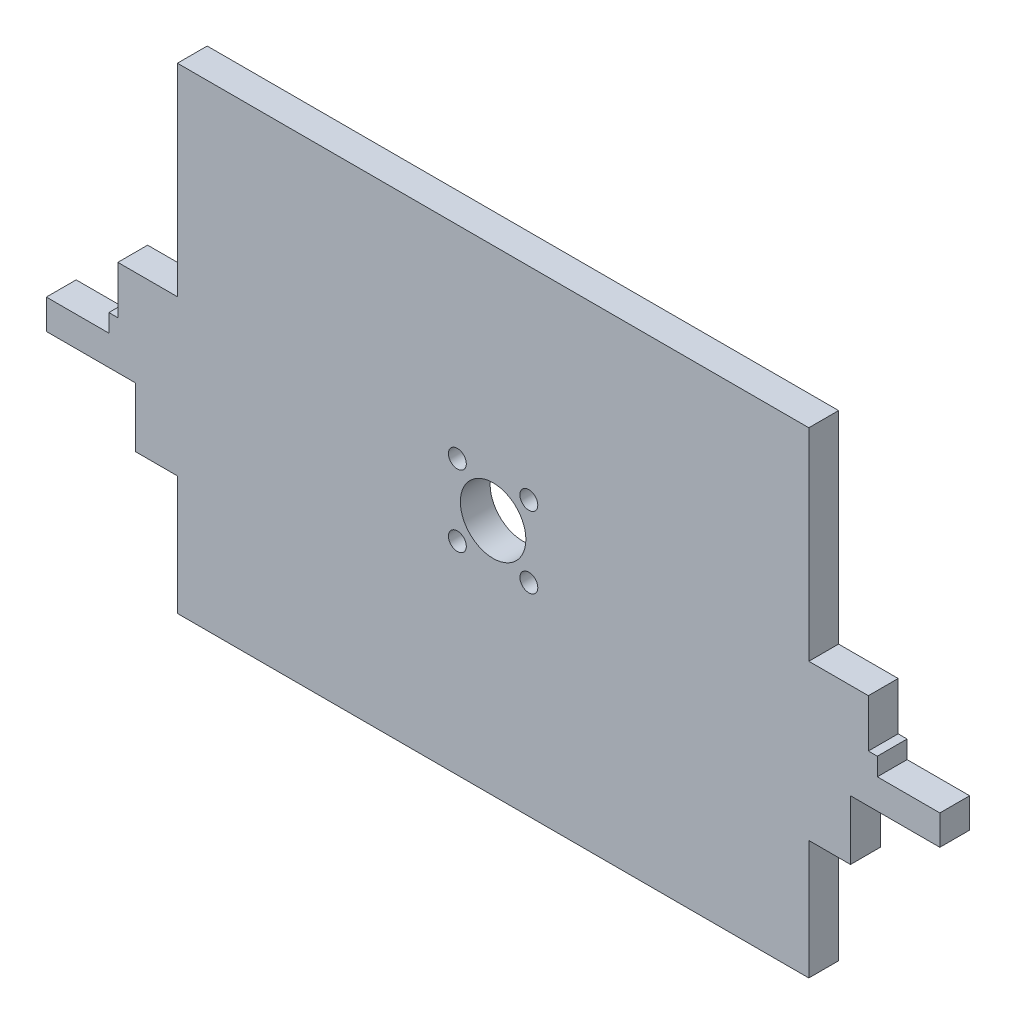
ISO-10303-21;
HEADER;
FILE_DESCRIPTION(('STEP AP214'),'2;1');
FILE_NAME('part.step','',(''),(''),'','','');
FILE_SCHEMA(('AUTOMOTIVE_DESIGN { 1 0 10303 214 1 1 1 1 }'));
ENDSEC;
DATA;
#1=APPLICATION_CONTEXT('core data for automotive mechanical design processes');
#2=APPLICATION_PROTOCOL_DEFINITION('international standard','automotive_design',2000,#1);
#3=PRODUCT_CONTEXT('',#1,'mechanical');
#4=PRODUCT('Part','Part','',(#3));
#5=PRODUCT_RELATED_PRODUCT_CATEGORY('part','',(#4));
#6=PRODUCT_DEFINITION_FORMATION('','',#4);
#7=PRODUCT_DEFINITION_CONTEXT('part definition',#1,'design');
#8=PRODUCT_DEFINITION('design','',#6,#7);
#9=PRODUCT_DEFINITION_SHAPE('','',#8);
#10=(LENGTH_UNIT() NAMED_UNIT(*) SI_UNIT(.MILLI.,.METRE.));
#11=(NAMED_UNIT(*) PLANE_ANGLE_UNIT() SI_UNIT($,.RADIAN.));
#12=(NAMED_UNIT(*) SI_UNIT($,.STERADIAN.) SOLID_ANGLE_UNIT());
#13=UNCERTAINTY_MEASURE_WITH_UNIT(LENGTH_MEASURE(1.E-05),#10,'distance_accuracy_value','');
#14=(GEOMETRIC_REPRESENTATION_CONTEXT(3) GLOBAL_UNCERTAINTY_ASSIGNED_CONTEXT((#13)) GLOBAL_UNIT_ASSIGNED_CONTEXT((#10,
#11,#12)) REPRESENTATION_CONTEXT('',''));
#15=CARTESIAN_POINT('',(0.,0.,0.));
#16=DIRECTION('',(0.,0.,1.));
#17=DIRECTION('',(1.,0.,0.));
#18=AXIS2_PLACEMENT_3D('',#15,#16,#17);
#19=CARTESIAN_POINT('',(-63.,0.,5.));
#20=DIRECTION('',(-1.,0.,0.));
#21=DIRECTION('',(0.,0.,1.));
#22=AXIS2_PLACEMENT_3D('',#19,#20,#21);
#23=PLANE('',#22);
#24=DIRECTION('',(0.,1.,0.));
#25=VECTOR('',#24,1.);
#26=CARTESIAN_POINT('',(-63.,0.,0.));
#27=LINE('',#26,#25);
#28=CARTESIAN_POINT('',(-63.,3.00000000000002,0.));
#29=VERTEX_POINT('',#28);
#30=CARTESIAN_POINT('',(-63.,11.0474120979369,0.));
#31=VERTEX_POINT('',#30);
#32=EDGE_CURVE('E244',#29,#31,#27,.T.);
#33=ORIENTED_EDGE('',*,*,#32,.F.);
#34=DIRECTION('',(0.,0.,-1.));
#35=VECTOR('',#34,1.);
#36=CARTESIAN_POINT('',(-63.,3.00000000000002,5.));
#37=LINE('',#36,#35);
#38=CARTESIAN_POINT('',(-63.,3.00000000000002,5.));
#39=VERTEX_POINT('',#38);
#40=EDGE_CURVE('E228',#39,#29,#37,.T.);
#41=ORIENTED_EDGE('',*,*,#40,.F.);
#42=DIRECTION('',(0.,1.,0.));
#43=VECTOR('',#42,1.);
#44=CARTESIAN_POINT('',(-63.,0.,5.));
#45=LINE('',#44,#43);
#46=CARTESIAN_POINT('',(-63.,11.0474120979369,5.));
#47=VERTEX_POINT('',#46);
#48=EDGE_CURVE('E254',#39,#47,#45,.T.);
#49=ORIENTED_EDGE('',*,*,#48,.T.);
#50=DIRECTION('',(0.,0.,-1.));
#51=VECTOR('',#50,1.);
#52=CARTESIAN_POINT('',(-63.,11.0474120979369,10.));
#53=LINE('',#52,#51);
#54=EDGE_CURVE('E252',#47,#31,#53,.T.);
#55=ORIENTED_EDGE('',*,*,#54,.T.);
#56=EDGE_LOOP('',(#33,#41,#49,#55));
#57=FACE_BOUND('',#56,.T.);
#58=ADVANCED_FACE('F67',(#57),#23,.T.);
#59=CARTESIAN_POINT('',(75.,0.,0.));
#60=DIRECTION('',(0.,-1.,0.));
#61=DIRECTION('',(0.,0.,-1.));
#62=AXIS2_PLACEMENT_3D('',#59,#60,#61);
#63=PLANE('',#62);
#64=DIRECTION('',(0.,0.,-1.));
#65=VECTOR('',#64,1.);
#66=CARTESIAN_POINT('',(64.5,0.,5.));
#67=LINE('',#66,#65);
#68=CARTESIAN_POINT('',(64.5,0.,5.));
#69=VERTEX_POINT('',#68);
#70=CARTESIAN_POINT('',(64.5,0.,0.));
#71=VERTEX_POINT('',#70);
#72=EDGE_CURVE('E417',#69,#71,#67,.T.);
#73=ORIENTED_EDGE('',*,*,#72,.F.);
#74=DIRECTION('',(-1.,0.,0.));
#75=VECTOR('',#74,1.);
#76=CARTESIAN_POINT('',(75.,0.,5.));
#77=LINE('',#76,#75);
#78=CARTESIAN_POINT('',(75.,0.,5.));
#79=VERTEX_POINT('',#78);
#80=EDGE_CURVE('E307',#79,#69,#77,.T.);
#81=ORIENTED_EDGE('',*,*,#80,.F.);
#82=DIRECTION('',(0.,0.,1.));
#83=VECTOR('',#82,1.);
#84=CARTESIAN_POINT('',(75.,0.,0.));
#85=LINE('',#84,#83);
#86=CARTESIAN_POINT('',(75.,0.,0.));
#87=VERTEX_POINT('',#86);
#88=EDGE_CURVE('E293',#87,#79,#85,.T.);
#89=ORIENTED_EDGE('',*,*,#88,.F.);
#90=DIRECTION('',(-1.,0.,0.));
#91=VECTOR('',#90,1.);
#92=CARTESIAN_POINT('',(75.,0.,0.));
#93=LINE('',#92,#91);
#94=EDGE_CURVE('E310',#87,#71,#93,.T.);
#95=ORIENTED_EDGE('',*,*,#94,.T.);
#96=EDGE_LOOP('',(#73,#81,#89,#95));
#97=FACE_BOUND('',#96,.T.);
#98=ADVANCED_FACE('F497',(#97),#63,.F.);
#99=CARTESIAN_POINT('',(0.,0.,5.));
#100=DIRECTION('',(0.,0.,1.));
#101=DIRECTION('',(1.,0.,0.));
#102=AXIS2_PLACEMENT_3D('',#99,#100,#101);
#103=PLANE('',#102);
#104=CARTESIAN_POINT('',(6.00000000000184,11.,5.));
#105=DIRECTION('',(0.,0.,1.));
#106=DIRECTION('',(1.,0.,0.));
#107=AXIS2_PLACEMENT_3D('',#104,#105,#106);
#108=CIRCLE('',#107,1.5);
#109=CARTESIAN_POINT('',(7.50000000000184,11.,5.));
#110=VERTEX_POINT('',#109);
#111=EDGE_CURVE('E239',#110,#110,#108,.T.);
#112=ORIENTED_EDGE('',*,*,#111,.F.);
#113=EDGE_LOOP('',(#112));
#114=FACE_BOUND('',#113,.T.);
#115=CARTESIAN_POINT('',(6.00000000000184,-1.00000000000004,5.));
#116=DIRECTION('',(0.,0.,1.));
#117=DIRECTION('',(1.,0.,0.));
#118=AXIS2_PLACEMENT_3D('',#115,#116,#117);
#119=CIRCLE('',#118,1.5);
#120=CARTESIAN_POINT('',(7.50000000000184,-1.00000000000004,5.));
#121=VERTEX_POINT('',#120);
#122=EDGE_CURVE('E444',#121,#121,#119,.T.);
#123=ORIENTED_EDGE('',*,*,#122,.F.);
#124=EDGE_LOOP('',(#123));
#125=FACE_BOUND('',#124,.T.);
#126=CARTESIAN_POINT('',(-5.99999999999816,-1.00000000000003,5.));
#127=DIRECTION('',(0.,0.,1.));
#128=DIRECTION('',(1.,0.,0.));
#129=AXIS2_PLACEMENT_3D('',#126,#127,#128);
#130=CIRCLE('',#129,1.5);
#131=CARTESIAN_POINT('',(-4.49999999999816,-1.00000000000003,5.));
#132=VERTEX_POINT('',#131);
#133=EDGE_CURVE('E447',#132,#132,#130,.T.);
#134=ORIENTED_EDGE('',*,*,#133,.F.);
#135=EDGE_LOOP('',(#134));
#136=FACE_BOUND('',#135,.T.);
#137=CARTESIAN_POINT('',(-5.99999999999816,11.,5.));
#138=DIRECTION('',(0.,0.,1.));
#139=DIRECTION('',(1.,0.,0.));
#140=AXIS2_PLACEMENT_3D('',#137,#138,#139);
#141=CIRCLE('',#140,1.5);
#142=CARTESIAN_POINT('',(-4.49999999999816,11.,5.));
#143=VERTEX_POINT('',#142);
#144=EDGE_CURVE('E450',#143,#143,#141,.T.);
#145=ORIENTED_EDGE('',*,*,#144,.F.);
#146=EDGE_LOOP('',(#145));
#147=FACE_BOUND('',#146,.T.);
#148=CARTESIAN_POINT('',(1.84227633148737E-12,4.99999999999996,5.));
#149=DIRECTION('',(0.,0.,1.));
#150=DIRECTION('',(1.,0.,0.));
#151=AXIS2_PLACEMENT_3D('',#148,#149,#150);
#152=CIRCLE('',#151,5.5);
#153=CARTESIAN_POINT('',(5.50000000000184,4.99999999999996,5.));
#154=VERTEX_POINT('',#153);
#155=EDGE_CURVE('E453',#154,#154,#152,.T.);
#156=ORIENTED_EDGE('',*,*,#155,.F.);
#157=EDGE_LOOP('',(#156));
#158=FACE_BOUND('',#157,.T.);
#159=ORIENTED_EDGE('',*,*,#48,.F.);
#160=DIRECTION('',(-1.,0.,0.));
#161=VECTOR('',#160,1.);
#162=CARTESIAN_POINT('',(-63.,3.00000000000002,5.));
#163=LINE('',#162,#161);
#164=CARTESIAN_POINT('',(-64.5,3.00000000000002,5.));
#165=VERTEX_POINT('',#164);
#166=EDGE_CURVE('E234',#39,#165,#163,.T.);
#167=ORIENTED_EDGE('',*,*,#166,.T.);
#168=DIRECTION('',(0.,1.,0.));
#169=VECTOR('',#168,1.);
#170=CARTESIAN_POINT('',(-64.5,0.,5.));
#171=LINE('',#170,#169);
#172=CARTESIAN_POINT('',(-64.5,0.,5.));
#173=VERTEX_POINT('',#172);
#174=EDGE_CURVE('E248',#173,#165,#171,.T.);
#175=ORIENTED_EDGE('',*,*,#174,.F.);
#176=DIRECTION('',(1.,0.,0.));
#177=VECTOR('',#176,1.);
#178=CARTESIAN_POINT('',(-75.,0.,5.));
#179=LINE('',#178,#177);
#180=CARTESIAN_POINT('',(-75.,0.,5.));
#181=VERTEX_POINT('',#180);
#182=EDGE_CURVE('E280',#181,#173,#179,.T.);
#183=ORIENTED_EDGE('',*,*,#182,.F.);
#184=DIRECTION('',(0.,1.,0.));
#185=VECTOR('',#184,1.);
#186=CARTESIAN_POINT('',(-75.,0.,5.));
#187=LINE('',#186,#185);
#188=CARTESIAN_POINT('',(-75.,-5.00258790206309,5.));
#189=VERTEX_POINT('',#188);
#190=EDGE_CURVE('E272',#189,#181,#187,.T.);
#191=ORIENTED_EDGE('',*,*,#190,.F.);
#192=DIRECTION('',(1.,0.,0.));
#193=VECTOR('',#192,1.);
#194=CARTESIAN_POINT('',(-75.,-5.00258790206309,5.));
#195=LINE('',#194,#193);
#196=CARTESIAN_POINT('',(-60.,-5.00258790206309,5.));
#197=VERTEX_POINT('',#196);
#198=EDGE_CURVE('E283',#189,#197,#195,.T.);
#199=ORIENTED_EDGE('',*,*,#198,.T.);
#200=DIRECTION('',(0.,-1.,0.));
#201=VECTOR('',#200,1.);
#202=CARTESIAN_POINT('',(-60.,-45.,5.));
#203=LINE('',#202,#201);
#204=CARTESIAN_POINT('',(-60.,-15.,5.));
#205=VERTEX_POINT('',#204);
#206=EDGE_CURVE('E320',#197,#205,#203,.T.);
#207=ORIENTED_EDGE('',*,*,#206,.T.);
#208=DIRECTION('',(-1.,0.,0.));
#209=VECTOR('',#208,1.);
#210=CARTESIAN_POINT('',(0.,-15.,5.));
#211=LINE('',#210,#209);
#212=CARTESIAN_POINT('',(-53.,-15.,5.));
#213=VERTEX_POINT('',#212);
#214=EDGE_CURVE('E346',#213,#205,#211,.T.);
#215=ORIENTED_EDGE('',*,*,#214,.F.);
#216=DIRECTION('',(0.,-1.,0.));
#217=VECTOR('',#216,1.);
#218=CARTESIAN_POINT('',(-53.,0.,5.));
#219=LINE('',#218,#217);
#220=CARTESIAN_POINT('',(-53.,-35.,5.));
#221=VERTEX_POINT('',#220);
#222=EDGE_CURVE('E345',#213,#221,#219,.T.);
#223=ORIENTED_EDGE('',*,*,#222,.T.);
#224=DIRECTION('',(-1.,0.,0.));
#225=VECTOR('',#224,1.);
#226=CARTESIAN_POINT('',(0.,-35.,5.));
#227=LINE('',#226,#225);
#228=CARTESIAN_POINT('',(53.,-35.,5.));
#229=VERTEX_POINT('',#228);
#230=EDGE_CURVE('E316',#229,#221,#227,.T.);
#231=ORIENTED_EDGE('',*,*,#230,.F.);
#232=DIRECTION('',(0.,-1.,0.));
#233=VECTOR('',#232,1.);
#234=CARTESIAN_POINT('',(53.,0.,5.));
#235=LINE('',#234,#233);
#236=CARTESIAN_POINT('',(53.,-15.,5.));
#237=VERTEX_POINT('',#236);
#238=EDGE_CURVE('E89',#237,#229,#235,.T.);
#239=ORIENTED_EDGE('',*,*,#238,.F.);
#240=DIRECTION('',(1.,0.,0.));
#241=VECTOR('',#240,1.);
#242=CARTESIAN_POINT('',(0.,-15.,5.));
#243=LINE('',#242,#241);
#244=CARTESIAN_POINT('',(60.,-15.,5.));
#245=VERTEX_POINT('',#244);
#246=EDGE_CURVE('E348',#237,#245,#243,.T.);
#247=ORIENTED_EDGE('',*,*,#246,.T.);
#248=DIRECTION('',(0.,1.,0.));
#249=VECTOR('',#248,1.);
#250=CARTESIAN_POINT('',(60.,-45.,5.));
#251=LINE('',#250,#249);
#252=CARTESIAN_POINT('',(60.,-5.00258790206311,5.));
#253=VERTEX_POINT('',#252);
#254=EDGE_CURVE('E323',#245,#253,#251,.T.);
#255=ORIENTED_EDGE('',*,*,#254,.T.);
#256=DIRECTION('',(-1.,0.,0.));
#257=VECTOR('',#256,1.);
#258=CARTESIAN_POINT('',(75.,-5.00258790206309,5.));
#259=LINE('',#258,#257);
#260=CARTESIAN_POINT('',(75.,-5.00258790206309,5.));
#261=VERTEX_POINT('',#260);
#262=EDGE_CURVE('E304',#261,#253,#259,.T.);
#263=ORIENTED_EDGE('',*,*,#262,.F.);
#264=DIRECTION('',(0.,-1.,0.));
#265=VECTOR('',#264,1.);
#266=CARTESIAN_POINT('',(75.,0.,5.));
#267=LINE('',#266,#265);
#268=EDGE_CURVE('E295',#79,#261,#267,.T.);
#269=ORIENTED_EDGE('',*,*,#268,.F.);
#270=ORIENTED_EDGE('',*,*,#80,.T.);
#271=DIRECTION('',(0.,1.,0.));
#272=VECTOR('',#271,1.);
#273=CARTESIAN_POINT('',(64.5,0.,5.));
#274=LINE('',#273,#272);
#275=CARTESIAN_POINT('',(64.5,3.,5.));
#276=VERTEX_POINT('',#275);
#277=EDGE_CURVE('E427',#69,#276,#274,.T.);
#278=ORIENTED_EDGE('',*,*,#277,.T.);
#279=DIRECTION('',(1.,0.,0.));
#280=VECTOR('',#279,1.);
#281=CARTESIAN_POINT('',(0.,3.,5.));
#282=LINE('',#281,#280);
#283=CARTESIAN_POINT('',(63.,3.,5.));
#284=VERTEX_POINT('',#283);
#285=EDGE_CURVE('E420',#284,#276,#282,.T.);
#286=ORIENTED_EDGE('',*,*,#285,.F.);
#287=DIRECTION('',(0.,-1.,0.));
#288=VECTOR('',#287,1.);
#289=CARTESIAN_POINT('',(63.,0.,5.));
#290=LINE('',#289,#288);
#291=CARTESIAN_POINT('',(63.,11.0474120979369,5.));
#292=VERTEX_POINT('',#291);
#293=EDGE_CURVE('E257',#292,#284,#290,.T.);
#294=ORIENTED_EDGE('',*,*,#293,.F.);
#295=DIRECTION('',(1.,0.,0.));
#296=VECTOR('',#295,1.);
#297=CARTESIAN_POINT('',(0.,11.0474120979369,5.));
#298=LINE('',#297,#296);
#299=CARTESIAN_POINT('',(53.,11.0474120979369,5.));
#300=VERTEX_POINT('',#299);
#301=EDGE_CURVE('E351',#300,#292,#298,.T.);
#302=ORIENTED_EDGE('',*,*,#301,.F.);
#303=DIRECTION('',(0.,-1.,0.));
#304=VECTOR('',#303,1.);
#305=CARTESIAN_POINT('',(53.,0.,5.));
#306=LINE('',#305,#304);
#307=CARTESIAN_POINT('',(53.,45.,5.));
#308=VERTEX_POINT('',#307);
#309=EDGE_CURVE('E259',#308,#300,#306,.T.);
#310=ORIENTED_EDGE('',*,*,#309,.F.);
#311=DIRECTION('',(-1.,0.,0.));
#312=VECTOR('',#311,1.);
#313=CARTESIAN_POINT('',(60.,45.,5.));
#314=LINE('',#313,#312);
#315=CARTESIAN_POINT('',(-53.,45.,5.));
#316=VERTEX_POINT('',#315);
#317=EDGE_CURVE('E326',#308,#316,#314,.T.);
#318=ORIENTED_EDGE('',*,*,#317,.T.);
#319=DIRECTION('',(0.,1.,0.));
#320=VECTOR('',#319,1.);
#321=CARTESIAN_POINT('',(-53.,0.,5.));
#322=LINE('',#321,#320);
#323=CARTESIAN_POINT('',(-53.,11.0474120979369,5.));
#324=VERTEX_POINT('',#323);
#325=EDGE_CURVE('E366',#324,#316,#322,.T.);
#326=ORIENTED_EDGE('',*,*,#325,.F.);
#327=DIRECTION('',(-1.,0.,0.));
#328=VECTOR('',#327,1.);
#329=CARTESIAN_POINT('',(0.,11.0474120979369,5.));
#330=LINE('',#329,#328);
#331=EDGE_CURVE('E356',#324,#47,#330,.T.);
#332=ORIENTED_EDGE('',*,*,#331,.T.);
#333=EDGE_LOOP('',(#159,#167,#175,#183,#191,#199,#207,#215,#223,#231,#239,#247,#255,#263,#269,
#270,#278,#286,#294,#302,#310,#318,#326,#332));
#334=FACE_BOUND('',#333,.T.);
#335=ADVANCED_FACE('F342',(#114,#125,#136,#147,#158,#334),#103,.T.);
#336=CARTESIAN_POINT('',(0.,0.,0.));
#337=DIRECTION('',(0.,0.,1.));
#338=DIRECTION('',(1.,0.,0.));
#339=AXIS2_PLACEMENT_3D('',#336,#337,#338);
#340=PLANE('',#339);
#341=CARTESIAN_POINT('',(6.00000000000184,11.,0.));
#342=DIRECTION('',(0.,0.,-1.));
#343=DIRECTION('',(-1.,0.,0.));
#344=AXIS2_PLACEMENT_3D('',#341,#342,#343);
#345=CIRCLE('',#344,1.5);
#346=CARTESIAN_POINT('',(4.50000000000184,11.,0.));
#347=VERTEX_POINT('',#346);
#348=EDGE_CURVE('E460',#347,#347,#345,.T.);
#349=ORIENTED_EDGE('',*,*,#348,.F.);
#350=EDGE_LOOP('',(#349));
#351=FACE_BOUND('',#350,.T.);
#352=CARTESIAN_POINT('',(6.00000000000184,-1.00000000000004,0.));
#353=DIRECTION('',(0.,0.,-1.));
#354=DIRECTION('',(-1.,0.,0.));
#355=AXIS2_PLACEMENT_3D('',#352,#353,#354);
#356=CIRCLE('',#355,1.5);
#357=CARTESIAN_POINT('',(4.50000000000184,-1.00000000000004,0.));
#358=VERTEX_POINT('',#357);
#359=EDGE_CURVE('E463',#358,#358,#356,.T.);
#360=ORIENTED_EDGE('',*,*,#359,.F.);
#361=EDGE_LOOP('',(#360));
#362=FACE_BOUND('',#361,.T.);
#363=CARTESIAN_POINT('',(-5.99999999999816,-1.00000000000003,0.));
#364=DIRECTION('',(0.,0.,-1.));
#365=DIRECTION('',(-1.,0.,0.));
#366=AXIS2_PLACEMENT_3D('',#363,#364,#365);
#367=CIRCLE('',#366,1.5);
#368=CARTESIAN_POINT('',(-7.49999999999816,-1.00000000000003,0.));
#369=VERTEX_POINT('',#368);
#370=EDGE_CURVE('E466',#369,#369,#367,.T.);
#371=ORIENTED_EDGE('',*,*,#370,.F.);
#372=EDGE_LOOP('',(#371));
#373=FACE_BOUND('',#372,.T.);
#374=CARTESIAN_POINT('',(-5.99999999999816,11.,0.));
#375=DIRECTION('',(0.,0.,-1.));
#376=DIRECTION('',(-1.,0.,0.));
#377=AXIS2_PLACEMENT_3D('',#374,#375,#376);
#378=CIRCLE('',#377,1.5);
#379=CARTESIAN_POINT('',(-7.49999999999816,11.,0.));
#380=VERTEX_POINT('',#379);
#381=EDGE_CURVE('E459',#380,#380,#378,.T.);
#382=ORIENTED_EDGE('',*,*,#381,.F.);
#383=EDGE_LOOP('',(#382));
#384=FACE_BOUND('',#383,.T.);
#385=CARTESIAN_POINT('',(1.84227633148737E-12,4.99999999999996,0.));
#386=DIRECTION('',(0.,0.,-1.));
#387=DIRECTION('',(-1.,0.,0.));
#388=AXIS2_PLACEMENT_3D('',#385,#386,#387);
#389=CIRCLE('',#388,5.5);
#390=CARTESIAN_POINT('',(-5.49999999999816,4.99999999999996,0.));
#391=VERTEX_POINT('',#390);
#392=EDGE_CURVE('E456',#391,#391,#389,.T.);
#393=ORIENTED_EDGE('',*,*,#392,.F.);
#394=EDGE_LOOP('',(#393));
#395=FACE_BOUND('',#394,.T.);
#396=DIRECTION('',(-1.,0.,0.));
#397=VECTOR('',#396,1.);
#398=CARTESIAN_POINT('',(-63.,3.00000000000002,0.));
#399=LINE('',#398,#397);
#400=CARTESIAN_POINT('',(-64.5,3.00000000000002,0.));
#401=VERTEX_POINT('',#400);
#402=EDGE_CURVE('E232',#29,#401,#399,.T.);
#403=ORIENTED_EDGE('',*,*,#402,.F.);
#404=ORIENTED_EDGE('',*,*,#32,.T.);
#405=DIRECTION('',(1.,0.,0.));
#406=VECTOR('',#405,1.);
#407=CARTESIAN_POINT('',(0.,11.0474120979369,0.));
#408=LINE('',#407,#406);
#409=CARTESIAN_POINT('',(-53.,11.0474120979369,0.));
#410=VERTEX_POINT('',#409);
#411=EDGE_CURVE('E396',#31,#410,#408,.T.);
#412=ORIENTED_EDGE('',*,*,#411,.T.);
#413=DIRECTION('',(0.,-1.,0.));
#414=VECTOR('',#413,1.);
#415=CARTESIAN_POINT('',(-53.,15.047412097937,0.));
#416=LINE('',#415,#414);
#417=CARTESIAN_POINT('',(-53.,45.,0.));
#418=VERTEX_POINT('',#417);
#419=EDGE_CURVE('E363',#418,#410,#416,.T.);
#420=ORIENTED_EDGE('',*,*,#419,.F.);
#421=DIRECTION('',(-1.,0.,0.));
#422=VECTOR('',#421,1.);
#423=CARTESIAN_POINT('',(60.,45.,0.));
#424=LINE('',#423,#422);
#425=CARTESIAN_POINT('',(53.,45.,0.));
#426=VERTEX_POINT('',#425);
#427=EDGE_CURVE('E324',#426,#418,#424,.T.);
#428=ORIENTED_EDGE('',*,*,#427,.F.);
#429=DIRECTION('',(0.,1.,0.));
#430=VECTOR('',#429,1.);
#431=CARTESIAN_POINT('',(53.,15.047412097937,0.));
#432=LINE('',#431,#430);
#433=CARTESIAN_POINT('',(53.,11.0474120979369,0.));
#434=VERTEX_POINT('',#433);
#435=EDGE_CURVE('E360',#434,#426,#432,.T.);
#436=ORIENTED_EDGE('',*,*,#435,.F.);
#437=DIRECTION('',(-1.,0.,0.));
#438=VECTOR('',#437,1.);
#439=CARTESIAN_POINT('',(0.,11.0474120979369,0.));
#440=LINE('',#439,#438);
#441=CARTESIAN_POINT('',(63.,11.0474120979369,0.));
#442=VERTEX_POINT('',#441);
#443=EDGE_CURVE('E384',#442,#434,#440,.T.);
#444=ORIENTED_EDGE('',*,*,#443,.F.);
#445=DIRECTION('',(0.,-1.,0.));
#446=VECTOR('',#445,1.);
#447=CARTESIAN_POINT('',(63.,0.,0.));
#448=LINE('',#447,#446);
#449=CARTESIAN_POINT('',(63.,3.,0.));
#450=VERTEX_POINT('',#449);
#451=EDGE_CURVE('E253',#442,#450,#448,.T.);
#452=ORIENTED_EDGE('',*,*,#451,.T.);
#453=DIRECTION('',(1.,0.,0.));
#454=VECTOR('',#453,1.);
#455=CARTESIAN_POINT('',(0.,3.,0.));
#456=LINE('',#455,#454);
#457=CARTESIAN_POINT('',(64.5,3.,0.));
#458=VERTEX_POINT('',#457);
#459=EDGE_CURVE('E424',#450,#458,#456,.T.);
#460=ORIENTED_EDGE('',*,*,#459,.T.);
#461=DIRECTION('',(0.,1.,0.));
#462=VECTOR('',#461,1.);
#463=CARTESIAN_POINT('',(64.5,0.,0.));
#464=LINE('',#463,#462);
#465=EDGE_CURVE('E428',#71,#458,#464,.T.);
#466=ORIENTED_EDGE('',*,*,#465,.F.);
#467=ORIENTED_EDGE('',*,*,#94,.F.);
#468=DIRECTION('',(0.,1.,0.));
#469=VECTOR('',#468,1.);
#470=CARTESIAN_POINT('',(75.,-5.00258790206309,0.));
#471=LINE('',#470,#469);
#472=CARTESIAN_POINT('',(75.,-5.00258790206309,0.));
#473=VERTEX_POINT('',#472);
#474=EDGE_CURVE('E290',#473,#87,#471,.T.);
#475=ORIENTED_EDGE('',*,*,#474,.F.);
#476=DIRECTION('',(-1.,0.,0.));
#477=VECTOR('',#476,1.);
#478=CARTESIAN_POINT('',(75.,-5.00258790206309,0.));
#479=LINE('',#478,#477);
#480=CARTESIAN_POINT('',(60.,-5.00258790206311,0.));
#481=VERTEX_POINT('',#480);
#482=EDGE_CURVE('E299',#473,#481,#479,.T.);
#483=ORIENTED_EDGE('',*,*,#482,.T.);
#484=DIRECTION('',(0.,1.,0.));
#485=VECTOR('',#484,1.);
#486=CARTESIAN_POINT('',(60.,-45.,0.));
#487=LINE('',#486,#485);
#488=CARTESIAN_POINT('',(60.,-15.,0.));
#489=VERTEX_POINT('',#488);
#490=EDGE_CURVE('E331',#489,#481,#487,.T.);
#491=ORIENTED_EDGE('',*,*,#490,.F.);
#492=DIRECTION('',(-1.,0.,0.));
#493=VECTOR('',#492,1.);
#494=CARTESIAN_POINT('',(0.,-15.,0.));
#495=LINE('',#494,#493);
#496=CARTESIAN_POINT('',(53.,-15.,0.));
#497=VERTEX_POINT('',#496);
#498=EDGE_CURVE('E411',#489,#497,#495,.T.);
#499=ORIENTED_EDGE('',*,*,#498,.T.);
#500=DIRECTION('',(0.,1.,0.));
#501=VECTOR('',#500,1.);
#502=CARTESIAN_POINT('',(53.,0.,0.));
#503=LINE('',#502,#501);
#504=CARTESIAN_POINT('',(53.,-35.,0.));
#505=VERTEX_POINT('',#504);
#506=EDGE_CURVE('E405',#505,#497,#503,.T.);
#507=ORIENTED_EDGE('',*,*,#506,.F.);
#508=DIRECTION('',(1.,0.,0.));
#509=VECTOR('',#508,1.);
#510=CARTESIAN_POINT('',(60.,-35.,0.));
#511=LINE('',#510,#509);
#512=CARTESIAN_POINT('',(-53.,-35.,0.));
#513=VERTEX_POINT('',#512);
#514=EDGE_CURVE('E313',#513,#505,#511,.T.);
#515=ORIENTED_EDGE('',*,*,#514,.F.);
#516=DIRECTION('',(0.,1.,0.));
#517=VECTOR('',#516,1.);
#518=CARTESIAN_POINT('',(-53.,0.,0.));
#519=LINE('',#518,#517);
#520=CARTESIAN_POINT('',(-53.,-15.,0.));
#521=VERTEX_POINT('',#520);
#522=EDGE_CURVE('E81',#513,#521,#519,.T.);
#523=ORIENTED_EDGE('',*,*,#522,.T.);
#524=DIRECTION('',(1.,0.,0.));
#525=VECTOR('',#524,1.);
#526=CARTESIAN_POINT('',(0.,-15.,0.));
#527=LINE('',#526,#525);
#528=CARTESIAN_POINT('',(-60.,-15.,0.));
#529=VERTEX_POINT('',#528);
#530=EDGE_CURVE('E403',#529,#521,#527,.T.);
#531=ORIENTED_EDGE('',*,*,#530,.F.);
#532=DIRECTION('',(0.,-1.,0.));
#533=VECTOR('',#532,1.);
#534=CARTESIAN_POINT('',(-60.,-45.,0.));
#535=LINE('',#534,#533);
#536=CARTESIAN_POINT('',(-60.,-5.00258790206311,0.));
#537=VERTEX_POINT('',#536);
#538=EDGE_CURVE('E319',#537,#529,#535,.T.);
#539=ORIENTED_EDGE('',*,*,#538,.F.);
#540=DIRECTION('',(1.,0.,0.));
#541=VECTOR('',#540,1.);
#542=CARTESIAN_POINT('',(-75.,-5.00258790206309,0.));
#543=LINE('',#542,#541);
#544=CARTESIAN_POINT('',(-75.,-5.00258790206309,0.));
#545=VERTEX_POINT('',#544);
#546=EDGE_CURVE('E286',#545,#537,#543,.T.);
#547=ORIENTED_EDGE('',*,*,#546,.F.);
#548=DIRECTION('',(0.,-1.,0.));
#549=VECTOR('',#548,1.);
#550=CARTESIAN_POINT('',(-75.,0.,0.));
#551=LINE('',#550,#549);
#552=CARTESIAN_POINT('',(-75.,0.,0.));
#553=VERTEX_POINT('',#552);
#554=EDGE_CURVE('E267',#553,#545,#551,.T.);
#555=ORIENTED_EDGE('',*,*,#554,.F.);
#556=DIRECTION('',(1.,0.,0.));
#557=VECTOR('',#556,1.);
#558=CARTESIAN_POINT('',(-75.,0.,0.));
#559=LINE('',#558,#557);
#560=CARTESIAN_POINT('',(-64.5,0.,0.));
#561=VERTEX_POINT('',#560);
#562=EDGE_CURVE('E276',#553,#561,#559,.T.);
#563=ORIENTED_EDGE('',*,*,#562,.T.);
#564=DIRECTION('',(0.,1.,0.));
#565=VECTOR('',#564,1.);
#566=CARTESIAN_POINT('',(-64.5,0.,0.));
#567=LINE('',#566,#565);
#568=EDGE_CURVE('E247',#561,#401,#567,.T.);
#569=ORIENTED_EDGE('',*,*,#568,.T.);
#570=EDGE_LOOP('',(#403,#404,#412,#420,#428,#436,#444,#452,#460,#466,#467,#475,#483,#491,#499,
#507,#515,#523,#531,#539,#547,#555,#563,#569));
#571=FACE_BOUND('',#570,.T.);
#572=ADVANCED_FACE('F242',(#351,#362,#373,#384,#395,#571),#340,.F.);
#573=CARTESIAN_POINT('',(60.,-45.,5.));
#574=DIRECTION('',(-1.,0.,0.));
#575=DIRECTION('',(0.,0.,1.));
#576=AXIS2_PLACEMENT_3D('',#573,#574,#575);
#577=PLANE('',#576);
#578=DIRECTION('',(0.,0.,-1.));
#579=VECTOR('',#578,1.);
#580=CARTESIAN_POINT('',(60.,-15.,10.));
#581=LINE('',#580,#579);
#582=EDGE_CURVE('E392',#245,#489,#581,.T.);
#583=ORIENTED_EDGE('',*,*,#582,.T.);
#584=ORIENTED_EDGE('',*,*,#490,.T.);
#585=DIRECTION('',(0.,0.,-1.));
#586=VECTOR('',#585,1.);
#587=CARTESIAN_POINT('',(60.,-5.00258790206309,5.));
#588=LINE('',#587,#586);
#589=EDGE_CURVE('E289',#253,#481,#588,.T.);
#590=ORIENTED_EDGE('',*,*,#589,.F.);
#591=ORIENTED_EDGE('',*,*,#254,.F.);
#592=EDGE_LOOP('',(#583,#584,#590,#591));
#593=FACE_BOUND('',#592,.T.);
#594=ADVANCED_FACE('F476',(#593),#577,.F.);
#595=CARTESIAN_POINT('',(60.,-35.,10.));
#596=DIRECTION('',(0.,1.,0.));
#597=DIRECTION('',(0.,0.,1.));
#598=AXIS2_PLACEMENT_3D('',#595,#596,#597);
#599=PLANE('',#598);
#600=DIRECTION('',(0.,0.,1.));
#601=VECTOR('',#600,1.);
#602=CARTESIAN_POINT('',(-53.,-35.,10.));
#603=LINE('',#602,#601);
#604=EDGE_CURVE('E12',#513,#221,#603,.T.);
#605=ORIENTED_EDGE('',*,*,#604,.F.);
#606=ORIENTED_EDGE('',*,*,#514,.T.);
#607=DIRECTION('',(0.,0.,1.));
#608=VECTOR('',#607,1.);
#609=CARTESIAN_POINT('',(53.,-35.,10.));
#610=LINE('',#609,#608);
#611=EDGE_CURVE('E75',#505,#229,#610,.T.);
#612=ORIENTED_EDGE('',*,*,#611,.T.);
#613=ORIENTED_EDGE('',*,*,#230,.T.);
#614=EDGE_LOOP('',(#605,#606,#612,#613));
#615=FACE_BOUND('',#614,.T.);
#616=ADVANCED_FACE('F336',(#615),#599,.F.);
#617=CARTESIAN_POINT('',(60.,45.,5.));
#618=DIRECTION('',(0.,-1.,0.));
#619=DIRECTION('',(1.,0.,0.));
#620=AXIS2_PLACEMENT_3D('',#617,#618,#619);
#621=PLANE('',#620);
#622=ORIENTED_EDGE('',*,*,#317,.F.);
#623=DIRECTION('',(0.,0.,-1.));
#624=VECTOR('',#623,1.);
#625=CARTESIAN_POINT('',(53.,45.,10.));
#626=LINE('',#625,#624);
#627=EDGE_CURVE('E362',#308,#426,#626,.T.);
#628=ORIENTED_EDGE('',*,*,#627,.T.);
#629=ORIENTED_EDGE('',*,*,#427,.T.);
#630=DIRECTION('',(0.,0.,-1.));
#631=VECTOR('',#630,1.);
#632=CARTESIAN_POINT('',(-53.,45.,10.));
#633=LINE('',#632,#631);
#634=EDGE_CURVE('E359',#316,#418,#633,.T.);
#635=ORIENTED_EDGE('',*,*,#634,.F.);
#636=EDGE_LOOP('',(#622,#628,#629,#635));
#637=FACE_BOUND('',#636,.T.);
#638=ADVANCED_FACE('F534',(#637),#621,.F.);
#639=CARTESIAN_POINT('',(-60.,-45.,5.));
#640=DIRECTION('',(1.,0.,0.));
#641=DIRECTION('',(0.,0.,-1.));
#642=AXIS2_PLACEMENT_3D('',#639,#640,#641);
#643=PLANE('',#642);
#644=ORIENTED_EDGE('',*,*,#538,.T.);
#645=DIRECTION('',(0.,0.,-1.));
#646=VECTOR('',#645,1.);
#647=CARTESIAN_POINT('',(-60.,-15.,10.));
#648=LINE('',#647,#646);
#649=EDGE_CURVE('E400',#205,#529,#648,.T.);
#650=ORIENTED_EDGE('',*,*,#649,.F.);
#651=ORIENTED_EDGE('',*,*,#206,.F.);
#652=DIRECTION('',(0.,0.,1.));
#653=VECTOR('',#652,1.);
#654=CARTESIAN_POINT('',(-60.,-5.00258790206309,0.));
#655=LINE('',#654,#653);
#656=EDGE_CURVE('E265',#537,#197,#655,.T.);
#657=ORIENTED_EDGE('',*,*,#656,.F.);
#658=EDGE_LOOP('',(#644,#650,#651,#657));
#659=FACE_BOUND('',#658,.T.);
#660=ADVANCED_FACE('F69',(#659),#643,.F.);
#661=CARTESIAN_POINT('',(75.,-5.00258790206309,5.));
#662=DIRECTION('',(0.,1.,0.));
#663=DIRECTION('',(0.,0.,1.));
#664=AXIS2_PLACEMENT_3D('',#661,#662,#663);
#665=PLANE('',#664);
#666=ORIENTED_EDGE('',*,*,#589,.T.);
#667=ORIENTED_EDGE('',*,*,#482,.F.);
#668=DIRECTION('',(0.,0.,-1.));
#669=VECTOR('',#668,1.);
#670=CARTESIAN_POINT('',(75.,-5.00258790206309,5.));
#671=LINE('',#670,#669);
#672=EDGE_CURVE('E297',#261,#473,#671,.T.);
#673=ORIENTED_EDGE('',*,*,#672,.F.);
#674=ORIENTED_EDGE('',*,*,#262,.T.);
#675=EDGE_LOOP('',(#666,#667,#673,#674));
#676=FACE_BOUND('',#675,.T.);
#677=ADVANCED_FACE('F527',(#676),#665,.F.);
#678=CARTESIAN_POINT('',(75.,0.,0.));
#679=DIRECTION('',(1.,0.,0.));
#680=DIRECTION('',(0.,0.,-1.));
#681=AXIS2_PLACEMENT_3D('',#678,#679,#680);
#682=PLANE('',#681);
#683=ORIENTED_EDGE('',*,*,#474,.T.);
#684=ORIENTED_EDGE('',*,*,#88,.T.);
#685=ORIENTED_EDGE('',*,*,#268,.T.);
#686=ORIENTED_EDGE('',*,*,#672,.T.);
#687=EDGE_LOOP('',(#683,#684,#685,#686));
#688=FACE_BOUND('',#687,.T.);
#689=ADVANCED_FACE('F523',(#688),#682,.T.);
#690=CARTESIAN_POINT('',(-75.,-5.00258790206309,0.));
#691=DIRECTION('',(0.,1.,0.));
#692=DIRECTION('',(0.,0.,1.));
#693=AXIS2_PLACEMENT_3D('',#690,#691,#692);
#694=PLANE('',#693);
#695=ORIENTED_EDGE('',*,*,#656,.T.);
#696=ORIENTED_EDGE('',*,*,#198,.F.);
#697=DIRECTION('',(0.,0.,1.));
#698=VECTOR('',#697,1.);
#699=CARTESIAN_POINT('',(-75.,-5.00258790206309,0.));
#700=LINE('',#699,#698);
#701=EDGE_CURVE('E270',#545,#189,#700,.T.);
#702=ORIENTED_EDGE('',*,*,#701,.F.);
#703=ORIENTED_EDGE('',*,*,#546,.T.);
#704=EDGE_LOOP('',(#695,#696,#702,#703));
#705=FACE_BOUND('',#704,.T.);
#706=ADVANCED_FACE('F519',(#705),#694,.F.);
#707=CARTESIAN_POINT('',(-75.,0.,0.));
#708=DIRECTION('',(0.,-1.,0.));
#709=DIRECTION('',(0.,0.,-1.));
#710=AXIS2_PLACEMENT_3D('',#707,#708,#709);
#711=PLANE('',#710);
#712=ORIENTED_EDGE('',*,*,#182,.T.);
#713=DIRECTION('',(0.,0.,-1.));
#714=VECTOR('',#713,1.);
#715=CARTESIAN_POINT('',(-64.5,0.,5.));
#716=LINE('',#715,#714);
#717=EDGE_CURVE('E437',#173,#561,#716,.T.);
#718=ORIENTED_EDGE('',*,*,#717,.T.);
#719=ORIENTED_EDGE('',*,*,#562,.F.);
#720=DIRECTION('',(0.,0.,-1.));
#721=VECTOR('',#720,1.);
#722=CARTESIAN_POINT('',(-75.,0.,0.));
#723=LINE('',#722,#721);
#724=EDGE_CURVE('E274',#181,#553,#723,.T.);
#725=ORIENTED_EDGE('',*,*,#724,.F.);
#726=EDGE_LOOP('',(#712,#718,#719,#725));
#727=FACE_BOUND('',#726,.T.);
#728=ADVANCED_FACE('F515',(#727),#711,.F.);
#729=CARTESIAN_POINT('',(-75.,0.,0.));
#730=DIRECTION('',(-1.,0.,0.));
#731=DIRECTION('',(0.,0.,1.));
#732=AXIS2_PLACEMENT_3D('',#729,#730,#731);
#733=PLANE('',#732);
#734=ORIENTED_EDGE('',*,*,#554,.T.);
#735=ORIENTED_EDGE('',*,*,#701,.T.);
#736=ORIENTED_EDGE('',*,*,#190,.T.);
#737=ORIENTED_EDGE('',*,*,#724,.T.);
#738=EDGE_LOOP('',(#734,#735,#736,#737));
#739=FACE_BOUND('',#738,.T.);
#740=ADVANCED_FACE('F511',(#739),#733,.T.);
#741=CARTESIAN_POINT('',(63.,0.,5.));
#742=DIRECTION('',(1.,0.,0.));
#743=DIRECTION('',(0.,0.,-1.));
#744=AXIS2_PLACEMENT_3D('',#741,#742,#743);
#745=PLANE('',#744);
#746=DIRECTION('',(0.,0.,-1.));
#747=VECTOR('',#746,1.);
#748=CARTESIAN_POINT('',(63.,3.,5.));
#749=LINE('',#748,#747);
#750=EDGE_CURVE('E419',#284,#450,#749,.T.);
#751=ORIENTED_EDGE('',*,*,#750,.T.);
#752=ORIENTED_EDGE('',*,*,#451,.F.);
#753=DIRECTION('',(0.,0.,-1.));
#754=VECTOR('',#753,1.);
#755=CARTESIAN_POINT('',(63.,11.0474120979369,10.));
#756=LINE('',#755,#754);
#757=EDGE_CURVE('E385',#292,#442,#756,.T.);
#758=ORIENTED_EDGE('',*,*,#757,.F.);
#759=ORIENTED_EDGE('',*,*,#293,.T.);
#760=EDGE_LOOP('',(#751,#752,#758,#759));
#761=FACE_BOUND('',#760,.T.);
#762=ADVANCED_FACE('F508',(#761),#745,.T.);
#763=CARTESIAN_POINT('',(53.,15.047412097937,10.));
#764=DIRECTION('',(-1.,0.,0.));
#765=DIRECTION('',(0.,0.,1.));
#766=AXIS2_PLACEMENT_3D('',#763,#764,#765);
#767=PLANE('',#766);
#768=ORIENTED_EDGE('',*,*,#309,.T.);
#769=DIRECTION('',(0.,0.,-1.));
#770=VECTOR('',#769,1.);
#771=CARTESIAN_POINT('',(53.,11.0474120979369,10.));
#772=LINE('',#771,#770);
#773=EDGE_CURVE('E376',#300,#434,#772,.T.);
#774=ORIENTED_EDGE('',*,*,#773,.T.);
#775=ORIENTED_EDGE('',*,*,#435,.T.);
#776=ORIENTED_EDGE('',*,*,#627,.F.);
#777=EDGE_LOOP('',(#768,#774,#775,#776));
#778=FACE_BOUND('',#777,.T.);
#779=ADVANCED_FACE('F375',(#778),#767,.F.);
#780=CARTESIAN_POINT('',(-53.,15.047412097937,10.));
#781=DIRECTION('',(1.,0.,0.));
#782=DIRECTION('',(0.,0.,-1.));
#783=AXIS2_PLACEMENT_3D('',#780,#781,#782);
#784=PLANE('',#783);
#785=ORIENTED_EDGE('',*,*,#325,.T.);
#786=ORIENTED_EDGE('',*,*,#634,.T.);
#787=ORIENTED_EDGE('',*,*,#419,.T.);
#788=DIRECTION('',(0.,0.,-1.));
#789=VECTOR('',#788,1.);
#790=CARTESIAN_POINT('',(-53.,11.0474120979369,10.));
#791=LINE('',#790,#789);
#792=EDGE_CURVE('E393',#324,#410,#791,.T.);
#793=ORIENTED_EDGE('',*,*,#792,.F.);
#794=EDGE_LOOP('',(#785,#786,#787,#793));
#795=FACE_BOUND('',#794,.T.);
#796=ADVANCED_FACE('F506',(#795),#784,.F.);
#797=CARTESIAN_POINT('',(0.,11.0474120979369,10.));
#798=DIRECTION('',(0.,1.,0.));
#799=DIRECTION('',(0.,0.,1.));
#800=AXIS2_PLACEMENT_3D('',#797,#798,#799);
#801=PLANE('',#800);
#802=ORIENTED_EDGE('',*,*,#792,.T.);
#803=ORIENTED_EDGE('',*,*,#411,.F.);
#804=ORIENTED_EDGE('',*,*,#54,.F.);
#805=ORIENTED_EDGE('',*,*,#331,.F.);
#806=EDGE_LOOP('',(#802,#803,#804,#805));
#807=FACE_BOUND('',#806,.T.);
#808=ADVANCED_FACE('F571',(#807),#801,.T.);
#809=CARTESIAN_POINT('',(0.,11.0474120979369,10.));
#810=DIRECTION('',(0.,-1.,0.));
#811=DIRECTION('',(0.,0.,-1.));
#812=AXIS2_PLACEMENT_3D('',#809,#810,#811);
#813=PLANE('',#812);
#814=ORIENTED_EDGE('',*,*,#301,.T.);
#815=ORIENTED_EDGE('',*,*,#757,.T.);
#816=ORIENTED_EDGE('',*,*,#443,.T.);
#817=ORIENTED_EDGE('',*,*,#773,.F.);
#818=EDGE_LOOP('',(#814,#815,#816,#817));
#819=FACE_BOUND('',#818,.T.);
#820=ADVANCED_FACE('F381',(#819),#813,.F.);
#821=CARTESIAN_POINT('',(0.,-15.,10.));
#822=DIRECTION('',(0.,-1.,0.));
#823=DIRECTION('',(0.,0.,-1.));
#824=AXIS2_PLACEMENT_3D('',#821,#822,#823);
#825=PLANE('',#824);
#826=DIRECTION('',(0.,0.,-1.));
#827=VECTOR('',#826,1.);
#828=CARTESIAN_POINT('',(53.,-15.,10.));
#829=LINE('',#828,#827);
#830=EDGE_CURVE('E409',#237,#497,#829,.T.);
#831=ORIENTED_EDGE('',*,*,#830,.T.);
#832=ORIENTED_EDGE('',*,*,#498,.F.);
#833=ORIENTED_EDGE('',*,*,#582,.F.);
#834=ORIENTED_EDGE('',*,*,#246,.F.);
#835=EDGE_LOOP('',(#831,#832,#833,#834));
#836=FACE_BOUND('',#835,.T.);
#837=ADVANCED_FACE('F554',(#836),#825,.T.);
#838=CARTESIAN_POINT('',(53.,0.,10.));
#839=DIRECTION('',(-1.,0.,0.));
#840=DIRECTION('',(0.,0.,1.));
#841=AXIS2_PLACEMENT_3D('',#838,#839,#840);
#842=PLANE('',#841);
#843=ORIENTED_EDGE('',*,*,#238,.T.);
#844=ORIENTED_EDGE('',*,*,#611,.F.);
#845=ORIENTED_EDGE('',*,*,#506,.T.);
#846=ORIENTED_EDGE('',*,*,#830,.F.);
#847=EDGE_LOOP('',(#843,#844,#845,#846));
#848=FACE_BOUND('',#847,.T.);
#849=ADVANCED_FACE('F555',(#848),#842,.F.);
#850=CARTESIAN_POINT('',(-53.,0.,10.));
#851=DIRECTION('',(-1.,0.,0.));
#852=DIRECTION('',(0.,0.,1.));
#853=AXIS2_PLACEMENT_3D('',#850,#851,#852);
#854=PLANE('',#853);
#855=DIRECTION('',(0.,0.,-1.));
#856=VECTOR('',#855,1.);
#857=CARTESIAN_POINT('',(-53.,-15.,10.));
#858=LINE('',#857,#856);
#859=EDGE_CURVE('E402',#213,#521,#858,.T.);
#860=ORIENTED_EDGE('',*,*,#859,.T.);
#861=ORIENTED_EDGE('',*,*,#522,.F.);
#862=ORIENTED_EDGE('',*,*,#604,.T.);
#863=ORIENTED_EDGE('',*,*,#222,.F.);
#864=EDGE_LOOP('',(#860,#861,#862,#863));
#865=FACE_BOUND('',#864,.T.);
#866=ADVANCED_FACE('F585',(#865),#854,.T.);
#867=CARTESIAN_POINT('',(0.,-15.,10.));
#868=DIRECTION('',(0.,1.,0.));
#869=DIRECTION('',(0.,0.,1.));
#870=AXIS2_PLACEMENT_3D('',#867,#868,#869);
#871=PLANE('',#870);
#872=ORIENTED_EDGE('',*,*,#214,.T.);
#873=ORIENTED_EDGE('',*,*,#649,.T.);
#874=ORIENTED_EDGE('',*,*,#530,.T.);
#875=ORIENTED_EDGE('',*,*,#859,.F.);
#876=EDGE_LOOP('',(#872,#873,#874,#875));
#877=FACE_BOUND('',#876,.T.);
#878=ADVANCED_FACE('F588',(#877),#871,.F.);
#879=CARTESIAN_POINT('',(64.5,0.,5.));
#880=DIRECTION('',(-1.,0.,0.));
#881=DIRECTION('',(0.,0.,1.));
#882=AXIS2_PLACEMENT_3D('',#879,#880,#881);
#883=PLANE('',#882);
#884=ORIENTED_EDGE('',*,*,#465,.T.);
#885=DIRECTION('',(0.,0.,-1.));
#886=VECTOR('',#885,1.);
#887=CARTESIAN_POINT('',(64.5,3.,5.));
#888=LINE('',#887,#886);
#889=EDGE_CURVE('E399',#276,#458,#888,.T.);
#890=ORIENTED_EDGE('',*,*,#889,.F.);
#891=ORIENTED_EDGE('',*,*,#277,.F.);
#892=ORIENTED_EDGE('',*,*,#72,.T.);
#893=EDGE_LOOP('',(#884,#890,#891,#892));
#894=FACE_BOUND('',#893,.T.);
#895=ADVANCED_FACE('F591',(#894),#883,.F.);
#896=CARTESIAN_POINT('',(0.,3.,5.));
#897=DIRECTION('',(0.,1.,0.));
#898=DIRECTION('',(0.,0.,1.));
#899=AXIS2_PLACEMENT_3D('',#896,#897,#898);
#900=PLANE('',#899);
#901=ORIENTED_EDGE('',*,*,#459,.F.);
#902=ORIENTED_EDGE('',*,*,#750,.F.);
#903=ORIENTED_EDGE('',*,*,#285,.T.);
#904=ORIENTED_EDGE('',*,*,#889,.T.);
#905=EDGE_LOOP('',(#901,#902,#903,#904));
#906=FACE_BOUND('',#905,.T.);
#907=ADVANCED_FACE('F598',(#906),#900,.T.);
#908=CARTESIAN_POINT('',(-63.,3.00000000000002,5.));
#909=DIRECTION('',(0.,-1.,0.));
#910=DIRECTION('',(0.,0.,-1.));
#911=AXIS2_PLACEMENT_3D('',#908,#909,#910);
#912=PLANE('',#911);
#913=ORIENTED_EDGE('',*,*,#402,.T.);
#914=DIRECTION('',(0.,0.,-1.));
#915=VECTOR('',#914,1.);
#916=CARTESIAN_POINT('',(-64.5,3.00000000000002,5.));
#917=LINE('',#916,#915);
#918=EDGE_CURVE('E238',#165,#401,#917,.T.);
#919=ORIENTED_EDGE('',*,*,#918,.F.);
#920=ORIENTED_EDGE('',*,*,#166,.F.);
#921=ORIENTED_EDGE('',*,*,#40,.T.);
#922=EDGE_LOOP('',(#913,#919,#920,#921));
#923=FACE_BOUND('',#922,.T.);
#924=ADVANCED_FACE('F230',(#923),#912,.F.);
#925=CARTESIAN_POINT('',(-64.5,0.,5.));
#926=DIRECTION('',(-1.,0.,0.));
#927=DIRECTION('',(0.,0.,1.));
#928=AXIS2_PLACEMENT_3D('',#925,#926,#927);
#929=PLANE('',#928);
#930=ORIENTED_EDGE('',*,*,#568,.F.);
#931=ORIENTED_EDGE('',*,*,#717,.F.);
#932=ORIENTED_EDGE('',*,*,#174,.T.);
#933=ORIENTED_EDGE('',*,*,#918,.T.);
#934=EDGE_LOOP('',(#930,#931,#932,#933));
#935=FACE_BOUND('',#934,.T.);
#936=ADVANCED_FACE('F483',(#935),#929,.T.);
#937=CARTESIAN_POINT('',(1.84227633148737E-12,4.99999999999996,10.));
#938=DIRECTION('',(0.,0.,-1.));
#939=DIRECTION('',(-1.,0.,0.));
#940=AXIS2_PLACEMENT_3D('',#937,#938,#939);
#941=CYLINDRICAL_SURFACE('',#940,5.5);
#942=ORIENTED_EDGE('',*,*,#155,.T.);
#943=EDGE_LOOP('',(#942));
#944=FACE_BOUND('',#943,.T.);
#945=ORIENTED_EDGE('',*,*,#392,.T.);
#946=EDGE_LOOP('',(#945));
#947=FACE_BOUND('',#946,.T.);
#948=ADVANCED_FACE('F481',(#944,#947),#941,.F.);
#949=CARTESIAN_POINT('',(-5.99999999999816,11.,10.));
#950=DIRECTION('',(0.,0.,-1.));
#951=DIRECTION('',(-1.,0.,0.));
#952=AXIS2_PLACEMENT_3D('',#949,#950,#951);
#953=CYLINDRICAL_SURFACE('',#952,1.5);
#954=ORIENTED_EDGE('',*,*,#144,.T.);
#955=EDGE_LOOP('',(#954));
#956=FACE_BOUND('',#955,.T.);
#957=ORIENTED_EDGE('',*,*,#381,.T.);
#958=EDGE_LOOP('',(#957));
#959=FACE_BOUND('',#958,.T.);
#960=ADVANCED_FACE('F472',(#956,#959),#953,.F.);
#961=CARTESIAN_POINT('',(-5.99999999999816,-1.00000000000003,10.));
#962=DIRECTION('',(0.,0.,-1.));
#963=DIRECTION('',(-1.,0.,0.));
#964=AXIS2_PLACEMENT_3D('',#961,#962,#963);
#965=CYLINDRICAL_SURFACE('',#964,1.5);
#966=ORIENTED_EDGE('',*,*,#133,.T.);
#967=EDGE_LOOP('',(#966));
#968=FACE_BOUND('',#967,.T.);
#969=ORIENTED_EDGE('',*,*,#370,.T.);
#970=EDGE_LOOP('',(#969));
#971=FACE_BOUND('',#970,.T.);
#972=ADVANCED_FACE('F490',(#968,#971),#965,.F.);
#973=CARTESIAN_POINT('',(6.00000000000184,-1.00000000000004,10.));
#974=DIRECTION('',(0.,0.,-1.));
#975=DIRECTION('',(-1.,0.,0.));
#976=AXIS2_PLACEMENT_3D('',#973,#974,#975);
#977=CYLINDRICAL_SURFACE('',#976,1.5);
#978=ORIENTED_EDGE('',*,*,#122,.T.);
#979=EDGE_LOOP('',(#978));
#980=FACE_BOUND('',#979,.T.);
#981=ORIENTED_EDGE('',*,*,#359,.T.);
#982=EDGE_LOOP('',(#981));
#983=FACE_BOUND('',#982,.T.);
#984=ADVANCED_FACE('F649',(#980,#983),#977,.F.);
#985=CARTESIAN_POINT('',(6.00000000000184,11.,10.));
#986=DIRECTION('',(0.,0.,-1.));
#987=DIRECTION('',(-1.,0.,0.));
#988=AXIS2_PLACEMENT_3D('',#985,#986,#987);
#989=CYLINDRICAL_SURFACE('',#988,1.5);
#990=ORIENTED_EDGE('',*,*,#111,.T.);
#991=EDGE_LOOP('',(#990));
#992=FACE_BOUND('',#991,.T.);
#993=ORIENTED_EDGE('',*,*,#348,.T.);
#994=EDGE_LOOP('',(#993));
#995=FACE_BOUND('',#994,.T.);
#996=ADVANCED_FACE('F660',(#992,#995),#989,.F.);
#997=CLOSED_SHELL('',(#58,#98,#335,#572,#594,#616,#638,#660,#677,#689,#706,#728,#740,#762,#779,
#796,#808,#820,#837,#849,#866,#878,#895,#907,#924,#936,#948,#960,#972,#984,#996));
#998=MANIFOLD_SOLID_BREP('B2',#997);
#999=ADVANCED_BREP_SHAPE_REPRESENTATION('',(#18,#998),#14);
#1000=SHAPE_DEFINITION_REPRESENTATION(#9,#999);
ENDSEC;
END-ISO-10303-21;
